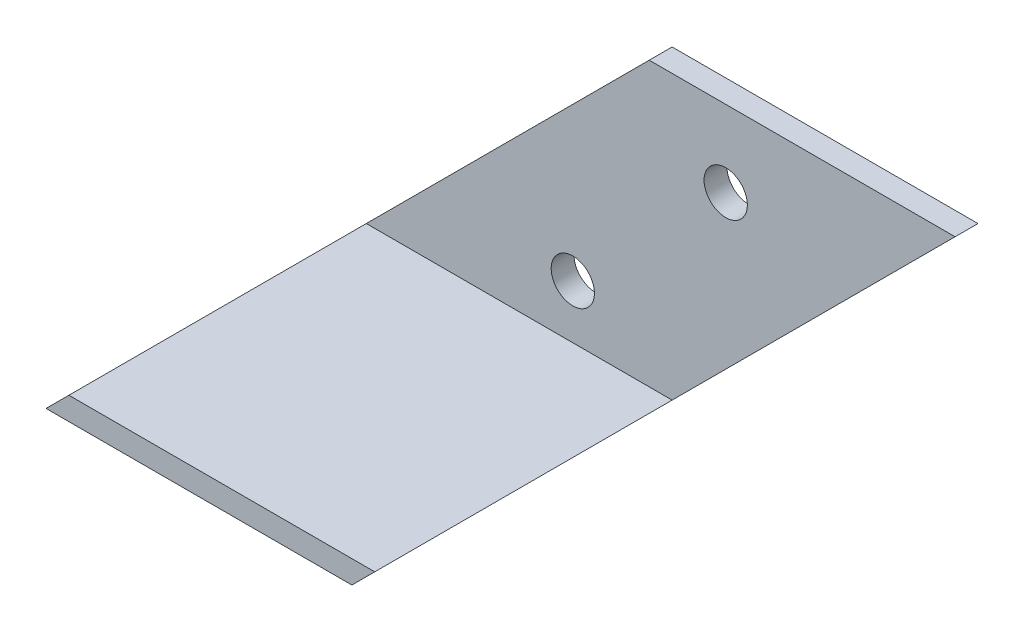
ISO-10303-21;
HEADER;
FILE_DESCRIPTION(('STEP AP214'),'2;1');
FILE_NAME('part.step','',(''),(''),'','','');
FILE_SCHEMA(('AUTOMOTIVE_DESIGN { 1 0 10303 214 1 1 1 1 }'));
ENDSEC;
DATA;
#1=APPLICATION_CONTEXT('core data for automotive mechanical design processes');
#2=APPLICATION_PROTOCOL_DEFINITION('international standard','automotive_design',2000,#1);
#3=PRODUCT_CONTEXT('',#1,'mechanical');
#4=PRODUCT('Part','Part','',(#3));
#5=PRODUCT_RELATED_PRODUCT_CATEGORY('part','',(#4));
#6=PRODUCT_DEFINITION_FORMATION('','',#4);
#7=PRODUCT_DEFINITION_CONTEXT('part definition',#1,'design');
#8=PRODUCT_DEFINITION('design','',#6,#7);
#9=PRODUCT_DEFINITION_SHAPE('','',#8);
#10=(LENGTH_UNIT() NAMED_UNIT(*) SI_UNIT(.MILLI.,.METRE.));
#11=(NAMED_UNIT(*) PLANE_ANGLE_UNIT() SI_UNIT($,.RADIAN.));
#12=(NAMED_UNIT(*) SI_UNIT($,.STERADIAN.) SOLID_ANGLE_UNIT());
#13=UNCERTAINTY_MEASURE_WITH_UNIT(LENGTH_MEASURE(1.E-05),#10,'distance_accuracy_value','');
#14=(GEOMETRIC_REPRESENTATION_CONTEXT(3) GLOBAL_UNCERTAINTY_ASSIGNED_CONTEXT((#13)) GLOBAL_UNIT_ASSIGNED_CONTEXT((#10,
#11,#12)) REPRESENTATION_CONTEXT('',''));
#15=CARTESIAN_POINT('',(0.,0.,0.));
#16=DIRECTION('',(0.,0.,1.));
#17=DIRECTION('',(1.,0.,0.));
#18=AXIS2_PLACEMENT_3D('',#15,#16,#17);
#19=CARTESIAN_POINT('',(0.,0.,1.5875));
#20=DIRECTION('',(0.,0.,-1.));
#21=DIRECTION('',(-1.,0.,0.));
#22=AXIS2_PLACEMENT_3D('',#19,#20,#21);
#23=PLANE('',#22);
#24=CARTESIAN_POINT('',(15.9091017178001,5.3025,1.5875));
#25=DIRECTION('',(0.,0.,-1.));
#26=DIRECTION('',(-1.,0.,0.));
#27=AXIS2_PLACEMENT_3D('',#24,#25,#26);
#28=CIRCLE('',#27,1.5);
#29=CARTESIAN_POINT('',(14.4091017178001,5.3025,1.5875));
#30=VERTEX_POINT('',#29);
#31=EDGE_CURVE('E140',#30,#30,#28,.T.);
#32=ORIENTED_EDGE('',*,*,#31,.T.);
#33=EDGE_LOOP('',(#32));
#34=FACE_BOUND('',#33,.T.);
#35=CARTESIAN_POINT('',(26.5141017178002,15.9075,1.5875));
#36=DIRECTION('',(0.,0.,-1.));
#37=DIRECTION('',(-1.,0.,0.));
#38=AXIS2_PLACEMENT_3D('',#35,#36,#37);
#39=CIRCLE('',#38,1.5);
#40=CARTESIAN_POINT('',(25.0141017178002,15.9075,1.5875));
#41=VERTEX_POINT('',#40);
#42=EDGE_CURVE('E146',#41,#41,#39,.T.);
#43=ORIENTED_EDGE('',*,*,#42,.T.);
#44=EDGE_LOOP('',(#43));
#45=FACE_BOUND('',#44,.T.);
#46=DIRECTION('',(0.707106781186551,0.707106781186544,0.));
#47=VECTOR('',#46,1.);
#48=CARTESIAN_POINT('',(0.,0.,1.5875));
#49=LINE('',#48,#47);
#50=CARTESIAN_POINT('',(1.58750000000001,1.58749999999999,1.5875));
#51=VERTEX_POINT('',#50);
#52=CARTESIAN_POINT('',(21.2100000000002,21.21,1.5875));
#53=VERTEX_POINT('',#52);
#54=EDGE_CURVE('E115',#51,#53,#49,.T.);
#55=ORIENTED_EDGE('',*,*,#54,.F.);
#56=DIRECTION('',(-1.,0.,0.));
#57=VECTOR('',#56,1.);
#58=CARTESIAN_POINT('',(45.,1.5875,1.5875));
#59=LINE('',#58,#57);
#60=CARTESIAN_POINT('',(22.8007034356,1.5875,1.5875));
#61=VERTEX_POINT('',#60);
#62=EDGE_CURVE('E109',#61,#51,#59,.T.);
#63=ORIENTED_EDGE('',*,*,#62,.F.);
#64=DIRECTION('',(0.707106781186551,0.707106781186544,0.));
#65=VECTOR('',#64,1.);
#66=CARTESIAN_POINT('',(10.6066017177999,-10.6066017178,1.5875));
#67=LINE('',#66,#65);
#68=CARTESIAN_POINT('',(42.4232034356002,21.21,1.5875));
#69=VERTEX_POINT('',#68);
#70=EDGE_CURVE('E129',#61,#69,#67,.T.);
#71=ORIENTED_EDGE('',*,*,#70,.T.);
#72=DIRECTION('',(-1.,0.,0.));
#73=VECTOR('',#72,1.);
#74=CARTESIAN_POINT('',(0.,21.21,1.5875));
#75=LINE('',#74,#73);
#76=EDGE_CURVE('E40',#69,#53,#75,.T.);
#77=ORIENTED_EDGE('',*,*,#76,.T.);
#78=EDGE_LOOP('',(#55,#63,#71,#77));
#79=FACE_BOUND('',#78,.T.);
#80=ADVANCED_FACE('F32',(#34,#45,#79),#23,.F.);
#81=CARTESIAN_POINT('',(0.,21.21,1.5875));
#82=DIRECTION('',(0.,-1.,0.));
#83=DIRECTION('',(0.,0.,-1.));
#84=AXIS2_PLACEMENT_3D('',#81,#82,#83);
#85=PLANE('',#84);
#86=DIRECTION('',(0.,0.,-1.));
#87=VECTOR('',#86,1.);
#88=CARTESIAN_POINT('',(21.2100000000002,21.21,22.2132034396));
#89=LINE('',#88,#87);
#90=CARTESIAN_POINT('',(21.2100000000002,21.21,0.));
#91=VERTEX_POINT('',#90);
#92=EDGE_CURVE('E85',#53,#91,#89,.T.);
#93=ORIENTED_EDGE('',*,*,#92,.F.);
#94=ORIENTED_EDGE('',*,*,#76,.F.);
#95=DIRECTION('',(0.,0.,-1.));
#96=VECTOR('',#95,1.);
#97=CARTESIAN_POINT('',(42.4232034356002,21.21,22.2132034396));
#98=LINE('',#97,#96);
#99=CARTESIAN_POINT('',(42.4232034356002,21.21,0.));
#100=VERTEX_POINT('',#99);
#101=EDGE_CURVE('E90',#69,#100,#98,.T.);
#102=ORIENTED_EDGE('',*,*,#101,.T.);
#103=DIRECTION('',(-1.,0.,0.));
#104=VECTOR('',#103,1.);
#105=CARTESIAN_POINT('',(0.,21.21,0.));
#106=LINE('',#105,#104);
#107=EDGE_CURVE('E99',#100,#91,#106,.T.);
#108=ORIENTED_EDGE('',*,*,#107,.T.);
#109=EDGE_LOOP('',(#93,#94,#102,#108));
#110=FACE_BOUND('',#109,.T.);
#111=ADVANCED_FACE('F119',(#110),#85,.F.);
#112=CARTESIAN_POINT('',(0.,0.,0.));
#113=DIRECTION('',(0.,0.,-1.));
#114=DIRECTION('',(-1.,0.,0.));
#115=AXIS2_PLACEMENT_3D('',#112,#113,#114);
#116=PLANE('',#115);
#117=CARTESIAN_POINT('',(15.9091017178001,5.3025,0.));
#118=DIRECTION('',(0.,0.,-1.));
#119=DIRECTION('',(-1.,0.,0.));
#120=AXIS2_PLACEMENT_3D('',#117,#118,#119);
#121=CIRCLE('',#120,1.5);
#122=CARTESIAN_POINT('',(14.4091017178001,5.3025,0.));
#123=VERTEX_POINT('',#122);
#124=EDGE_CURVE('E149',#123,#123,#121,.T.);
#125=ORIENTED_EDGE('',*,*,#124,.F.);
#126=EDGE_LOOP('',(#125));
#127=FACE_BOUND('',#126,.T.);
#128=CARTESIAN_POINT('',(26.5141017178002,15.9075,0.));
#129=DIRECTION('',(0.,0.,-1.));
#130=DIRECTION('',(-1.,0.,0.));
#131=AXIS2_PLACEMENT_3D('',#128,#129,#130);
#132=CIRCLE('',#131,1.5);
#133=CARTESIAN_POINT('',(25.0141017178002,15.9075,0.));
#134=VERTEX_POINT('',#133);
#135=EDGE_CURVE('E150',#134,#134,#132,.T.);
#136=ORIENTED_EDGE('',*,*,#135,.F.);
#137=EDGE_LOOP('',(#136));
#138=FACE_BOUND('',#137,.T.);
#139=DIRECTION('',(1.,0.,0.));
#140=VECTOR('',#139,1.);
#141=CARTESIAN_POINT('',(0.,0.,0.));
#142=LINE('',#141,#140);
#143=CARTESIAN_POINT('',(0.,0.,0.));
#144=VERTEX_POINT('',#143);
#145=CARTESIAN_POINT('',(21.2132034356,0.,0.));
#146=VERTEX_POINT('',#145);
#147=EDGE_CURVE('E94',#144,#146,#142,.T.);
#148=ORIENTED_EDGE('',*,*,#147,.F.);
#149=DIRECTION('',(0.707106781186551,0.707106781186544,0.));
#150=VECTOR('',#149,1.);
#151=CARTESIAN_POINT('',(0.,0.,0.));
#152=LINE('',#151,#150);
#153=EDGE_CURVE('E81',#144,#91,#152,.T.);
#154=ORIENTED_EDGE('',*,*,#153,.T.);
#155=ORIENTED_EDGE('',*,*,#107,.F.);
#156=DIRECTION('',(0.707106781186551,0.707106781186544,0.));
#157=VECTOR('',#156,1.);
#158=CARTESIAN_POINT('',(10.6066017177999,-10.6066017178,0.));
#159=LINE('',#158,#157);
#160=EDGE_CURVE('E96',#146,#100,#159,.T.);
#161=ORIENTED_EDGE('',*,*,#160,.F.);
#162=EDGE_LOOP('',(#148,#154,#155,#161));
#163=FACE_BOUND('',#162,.T.);
#164=ADVANCED_FACE('F95',(#127,#138,#163),#116,.T.);
#165=CARTESIAN_POINT('',(45.,1.5875,22.2132034396));
#166=DIRECTION('',(0.,-1.,0.));
#167=DIRECTION('',(1.,0.,0.));
#168=AXIS2_PLACEMENT_3D('',#165,#166,#167);
#169=PLANE('',#168);
#170=DIRECTION('',(0.,0.,-1.));
#171=VECTOR('',#170,1.);
#172=CARTESIAN_POINT('',(1.58750000000001,1.58749999999999,22.2132034396));
#173=LINE('',#172,#171);
#174=CARTESIAN_POINT('',(1.58750000000002,1.5875,22.2132034396));
#175=VERTEX_POINT('',#174);
#176=EDGE_CURVE('E131',#175,#51,#173,.T.);
#177=ORIENTED_EDGE('',*,*,#176,.F.);
#178=DIRECTION('',(-1.,0.,0.));
#179=VECTOR('',#178,1.);
#180=CARTESIAN_POINT('',(45.,1.5875,22.2132034396));
#181=LINE('',#180,#179);
#182=CARTESIAN_POINT('',(22.8007034356,1.58750000000001,22.2132034396));
#183=VERTEX_POINT('',#182);
#184=EDGE_CURVE('E106',#183,#175,#181,.T.);
#185=ORIENTED_EDGE('',*,*,#184,.F.);
#186=DIRECTION('',(0.,0.,-1.));
#187=VECTOR('',#186,1.);
#188=CARTESIAN_POINT('',(22.8007034356,1.5875,22.2132034396));
#189=LINE('',#188,#187);
#190=EDGE_CURVE('E47',#183,#61,#189,.T.);
#191=ORIENTED_EDGE('',*,*,#190,.T.);
#192=ORIENTED_EDGE('',*,*,#62,.T.);
#193=EDGE_LOOP('',(#177,#185,#191,#192));
#194=FACE_BOUND('',#193,.T.);
#195=ADVANCED_FACE('F137',(#194),#169,.F.);
#196=CARTESIAN_POINT('',(0.,0.,22.2132034396));
#197=DIRECTION('',(0.,0.,1.));
#198=DIRECTION('',(1.,0.,0.));
#199=AXIS2_PLACEMENT_3D('',#196,#197,#198);
#200=PLANE('',#199);
#201=ORIENTED_EDGE('',*,*,#184,.T.);
#202=DIRECTION('',(0.707106781186551,0.707106781186544,0.));
#203=VECTOR('',#202,1.);
#204=CARTESIAN_POINT('',(0.,0.,22.2132034396));
#205=LINE('',#204,#203);
#206=CARTESIAN_POINT('',(0.,0.,22.2132034396));
#207=VERTEX_POINT('',#206);
#208=EDGE_CURVE('E89',#207,#175,#205,.T.);
#209=ORIENTED_EDGE('',*,*,#208,.F.);
#210=DIRECTION('',(1.,0.,0.));
#211=VECTOR('',#210,1.);
#212=CARTESIAN_POINT('',(45.,0.,22.2132034396));
#213=LINE('',#212,#211);
#214=CARTESIAN_POINT('',(21.2132034356,0.,22.2132034396));
#215=VERTEX_POINT('',#214);
#216=EDGE_CURVE('E100',#207,#215,#213,.T.);
#217=ORIENTED_EDGE('',*,*,#216,.T.);
#218=DIRECTION('',(0.707106781186551,0.707106781186544,0.));
#219=VECTOR('',#218,1.);
#220=CARTESIAN_POINT('',(10.6066017177999,-10.6066017178,22.2132034396));
#221=LINE('',#220,#219);
#222=EDGE_CURVE('E123',#215,#183,#221,.T.);
#223=ORIENTED_EDGE('',*,*,#222,.T.);
#224=EDGE_LOOP('',(#201,#209,#217,#223));
#225=FACE_BOUND('',#224,.T.);
#226=ADVANCED_FACE('F139',(#225),#200,.T.);
#227=CARTESIAN_POINT('',(0.,0.,1.5875));
#228=DIRECTION('',(0.,1.,0.));
#229=DIRECTION('',(0.,0.,1.));
#230=AXIS2_PLACEMENT_3D('',#227,#228,#229);
#231=PLANE('',#230);
#232=ORIENTED_EDGE('',*,*,#147,.T.);
#233=DIRECTION('',(0.,0.,-1.));
#234=VECTOR('',#233,1.);
#235=CARTESIAN_POINT('',(21.2132034356,0.,22.2132034396));
#236=LINE('',#235,#234);
#237=EDGE_CURVE('E104',#215,#146,#236,.T.);
#238=ORIENTED_EDGE('',*,*,#237,.F.);
#239=ORIENTED_EDGE('',*,*,#216,.F.);
#240=DIRECTION('',(0.,0.,-1.));
#241=VECTOR('',#240,1.);
#242=CARTESIAN_POINT('',(0.,0.,1.5875));
#243=LINE('',#242,#241);
#244=EDGE_CURVE('E11',#207,#144,#243,.T.);
#245=ORIENTED_EDGE('',*,*,#244,.T.);
#246=EDGE_LOOP('',(#232,#238,#239,#245));
#247=FACE_BOUND('',#246,.T.);
#248=ADVANCED_FACE('F34',(#247),#231,.F.);
#249=CARTESIAN_POINT('',(10.6066017177999,-10.6066017178,22.2132034396));
#250=DIRECTION('',(-0.707106781186544,0.707106781186551,0.));
#251=DIRECTION('',(-0.707106781186551,-0.707106781186544,0.));
#252=AXIS2_PLACEMENT_3D('',#249,#250,#251);
#253=PLANE('',#252);
#254=ORIENTED_EDGE('',*,*,#190,.F.);
#255=ORIENTED_EDGE('',*,*,#222,.F.);
#256=ORIENTED_EDGE('',*,*,#237,.T.);
#257=ORIENTED_EDGE('',*,*,#160,.T.);
#258=ORIENTED_EDGE('',*,*,#101,.F.);
#259=ORIENTED_EDGE('',*,*,#70,.F.);
#260=EDGE_LOOP('',(#254,#255,#256,#257,#258,#259));
#261=FACE_BOUND('',#260,.T.);
#262=ADVANCED_FACE('F181',(#261),#253,.F.);
#263=CARTESIAN_POINT('',(0.,0.,22.2132034396));
#264=DIRECTION('',(-0.707106781186544,0.707106781186551,0.));
#265=DIRECTION('',(-0.707106781186551,-0.707106781186544,0.));
#266=AXIS2_PLACEMENT_3D('',#263,#264,#265);
#267=PLANE('',#266);
#268=ORIENTED_EDGE('',*,*,#54,.T.);
#269=ORIENTED_EDGE('',*,*,#92,.T.);
#270=ORIENTED_EDGE('',*,*,#153,.F.);
#271=ORIENTED_EDGE('',*,*,#244,.F.);
#272=ORIENTED_EDGE('',*,*,#208,.T.);
#273=ORIENTED_EDGE('',*,*,#176,.T.);
#274=EDGE_LOOP('',(#268,#269,#270,#271,#272,#273));
#275=FACE_BOUND('',#274,.T.);
#276=ADVANCED_FACE('F83',(#275),#267,.T.);
#277=CARTESIAN_POINT('',(26.5141017178002,15.9075,22.2132034396));
#278=DIRECTION('',(0.,0.,-1.));
#279=DIRECTION('',(-1.,0.,0.));
#280=AXIS2_PLACEMENT_3D('',#277,#278,#279);
#281=CYLINDRICAL_SURFACE('',#280,1.5);
#282=ORIENTED_EDGE('',*,*,#135,.T.);
#283=EDGE_LOOP('',(#282));
#284=FACE_BOUND('',#283,.T.);
#285=ORIENTED_EDGE('',*,*,#42,.F.);
#286=EDGE_LOOP('',(#285));
#287=FACE_BOUND('',#286,.T.);
#288=ADVANCED_FACE('F164',(#284,#287),#281,.F.);
#289=CARTESIAN_POINT('',(15.9091017178001,5.3025,22.2132034396));
#290=DIRECTION('',(0.,0.,-1.));
#291=DIRECTION('',(-1.,0.,0.));
#292=AXIS2_PLACEMENT_3D('',#289,#290,#291);
#293=CYLINDRICAL_SURFACE('',#292,1.5);
#294=ORIENTED_EDGE('',*,*,#124,.T.);
#295=EDGE_LOOP('',(#294));
#296=FACE_BOUND('',#295,.T.);
#297=ORIENTED_EDGE('',*,*,#31,.F.);
#298=EDGE_LOOP('',(#297));
#299=FACE_BOUND('',#298,.T.);
#300=ADVANCED_FACE('F156',(#296,#299),#293,.F.);
#301=CLOSED_SHELL('',(#80,#111,#164,#195,#226,#248,#262,#276,#288,#300));
#302=MANIFOLD_SOLID_BREP('B2',#301);
#303=ADVANCED_BREP_SHAPE_REPRESENTATION('',(#18,#302),#14);
#304=SHAPE_DEFINITION_REPRESENTATION(#9,#303);
ENDSEC;
END-ISO-10303-21;
